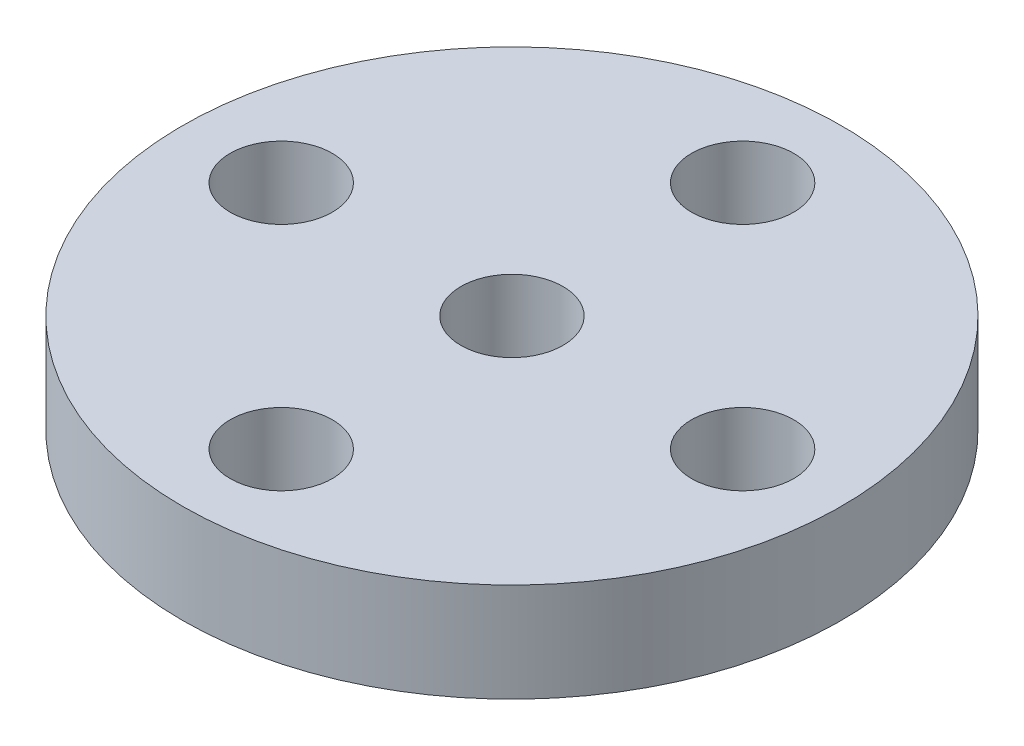
ISO-10303-21;
HEADER;
FILE_DESCRIPTION(('STEP AP214'),'2;1');
FILE_NAME('part.step','',(''),(''),'','','');
FILE_SCHEMA(('AUTOMOTIVE_DESIGN { 1 0 10303 214 1 1 1 1 }'));
ENDSEC;
DATA;
#1=APPLICATION_CONTEXT('core data for automotive mechanical design processes');
#2=APPLICATION_PROTOCOL_DEFINITION('international standard','automotive_design',2000,#1);
#3=PRODUCT_CONTEXT('',#1,'mechanical');
#4=PRODUCT('Part','Part','',(#3));
#5=PRODUCT_RELATED_PRODUCT_CATEGORY('part','',(#4));
#6=PRODUCT_DEFINITION_FORMATION('','',#4);
#7=PRODUCT_DEFINITION_CONTEXT('part definition',#1,'design');
#8=PRODUCT_DEFINITION('design','',#6,#7);
#9=PRODUCT_DEFINITION_SHAPE('','',#8);
#10=(LENGTH_UNIT() NAMED_UNIT(*) SI_UNIT(.MILLI.,.METRE.));
#11=(NAMED_UNIT(*) PLANE_ANGLE_UNIT() SI_UNIT($,.RADIAN.));
#12=(NAMED_UNIT(*) SI_UNIT($,.STERADIAN.) SOLID_ANGLE_UNIT());
#13=UNCERTAINTY_MEASURE_WITH_UNIT(LENGTH_MEASURE(1.E-05),#10,'distance_accuracy_value','');
#14=(GEOMETRIC_REPRESENTATION_CONTEXT(3) GLOBAL_UNCERTAINTY_ASSIGNED_CONTEXT((#13)) GLOBAL_UNIT_ASSIGNED_CONTEXT((#10,
#11,#12)) REPRESENTATION_CONTEXT('',''));
#15=CARTESIAN_POINT('',(0.,0.,0.));
#16=DIRECTION('',(0.,0.,1.));
#17=DIRECTION('',(1.,0.,0.));
#18=AXIS2_PLACEMENT_3D('',#15,#16,#17);
#19=CARTESIAN_POINT('',(0.,0.,0.));
#20=DIRECTION('',(0.,1.,0.));
#21=DIRECTION('',(0.,0.,1.));
#22=AXIS2_PLACEMENT_3D('',#19,#20,#21);
#23=PLANE('',#22);
#24=CARTESIAN_POINT('',(0.,0.,0.));
#25=DIRECTION('',(0.,1.,0.));
#26=DIRECTION('',(0.,0.,1.));
#27=AXIS2_PLACEMENT_3D('',#24,#25,#26);
#28=CIRCLE('',#27,4.);
#29=CARTESIAN_POINT('',(0.,0.,4.));
#30=VERTEX_POINT('',#29);
#31=EDGE_CURVE('E36',#30,#30,#28,.T.);
#32=ORIENTED_EDGE('',*,*,#31,.F.);
#33=EDGE_LOOP('',(#32));
#34=FACE_BOUND('',#33,.T.);
#35=CARTESIAN_POINT('',(0.,0.,0.));
#36=DIRECTION('',(0.,1.,0.));
#37=DIRECTION('',(0.,0.,1.));
#38=AXIS2_PLACEMENT_3D('',#35,#36,#37);
#39=CIRCLE('',#38,1.55);
#40=CARTESIAN_POINT('',(0.,0.,1.55));
#41=VERTEX_POINT('',#40);
#42=EDGE_CURVE('E43',#41,#41,#39,.T.);
#43=ORIENTED_EDGE('',*,*,#42,.T.);
#44=EDGE_LOOP('',(#43));
#45=FACE_BOUND('',#44,.T.);
#46=ADVANCED_FACE('F32',(#34,#45),#23,.F.);
#47=CARTESIAN_POINT('',(0.,4.,0.));
#48=DIRECTION('',(0.,-1.,0.));
#49=DIRECTION('',(0.,0.,-1.));
#50=AXIS2_PLACEMENT_3D('',#47,#48,#49);
#51=CYLINDRICAL_SURFACE('',#50,4.);
#52=CARTESIAN_POINT('',(0.,4.,0.));
#53=DIRECTION('',(0.,1.,0.));
#54=DIRECTION('',(0.,0.,1.));
#55=AXIS2_PLACEMENT_3D('',#52,#53,#54);
#56=CIRCLE('',#55,4.);
#57=CARTESIAN_POINT('',(0.,4.,4.));
#58=VERTEX_POINT('',#57);
#59=EDGE_CURVE('E10',#58,#58,#56,.T.);
#60=ORIENTED_EDGE('',*,*,#59,.F.);
#61=EDGE_LOOP('',(#60));
#62=FACE_BOUND('',#61,.T.);
#63=ORIENTED_EDGE('',*,*,#31,.T.);
#64=EDGE_LOOP('',(#63));
#65=FACE_BOUND('',#64,.T.);
#66=ADVANCED_FACE('F34',(#62,#65),#51,.T.);
#67=CARTESIAN_POINT('',(0.,4.,0.));
#68=DIRECTION('',(0.,-1.,0.));
#69=DIRECTION('',(0.,0.,-1.));
#70=AXIS2_PLACEMENT_3D('',#67,#68,#69);
#71=CYLINDRICAL_SURFACE('',#70,1.55);
#72=ORIENTED_EDGE('',*,*,#42,.F.);
#73=EDGE_LOOP('',(#72));
#74=FACE_BOUND('',#73,.T.);
#75=CARTESIAN_POINT('',(0.,7.,0.));
#76=DIRECTION('',(0.,1.,0.));
#77=DIRECTION('',(0.,0.,1.));
#78=AXIS2_PLACEMENT_3D('',#75,#76,#77);
#79=CIRCLE('',#78,1.55);
#80=CARTESIAN_POINT('',(0.,7.,1.55));
#81=VERTEX_POINT('',#80);
#82=EDGE_CURVE('E51',#81,#81,#79,.T.);
#83=ORIENTED_EDGE('',*,*,#82,.T.);
#84=EDGE_LOOP('',(#83));
#85=FACE_BOUND('',#84,.T.);
#86=ADVANCED_FACE('F87',(#74,#85),#71,.F.);
#87=CARTESIAN_POINT('',(0.,7.,0.));
#88=DIRECTION('',(0.,1.,0.));
#89=DIRECTION('',(0.,0.,1.));
#90=AXIS2_PLACEMENT_3D('',#87,#88,#89);
#91=PLANE('',#90);
#92=CARTESIAN_POINT('',(3.95332173747447E-13,7.,7.));
#93=DIRECTION('',(0.,1.,0.));
#94=DIRECTION('',(0.,0.,1.));
#95=AXIS2_PLACEMENT_3D('',#92,#93,#94);
#96=CIRCLE('',#95,1.55000000000042);
#97=CARTESIAN_POINT('',(3.95332173747447E-13,7.,8.55000000000043));
#98=VERTEX_POINT('',#97);
#99=EDGE_CURVE('E66',#98,#98,#96,.T.);
#100=ORIENTED_EDGE('',*,*,#99,.F.);
#101=EDGE_LOOP('',(#100));
#102=FACE_BOUND('',#101,.T.);
#103=CARTESIAN_POINT('',(0.,7.,-7.));
#104=DIRECTION('',(0.,1.,0.));
#105=DIRECTION('',(0.,0.,1.));
#106=AXIS2_PLACEMENT_3D('',#103,#104,#105);
#107=CIRCLE('',#106,1.55);
#108=CARTESIAN_POINT('',(0.,7.,-5.45));
#109=VERTEX_POINT('',#108);
#110=EDGE_CURVE('E56',#109,#109,#107,.T.);
#111=ORIENTED_EDGE('',*,*,#110,.F.);
#112=EDGE_LOOP('',(#111));
#113=FACE_BOUND('',#112,.T.);
#114=CARTESIAN_POINT('',(0.,7.,0.));
#115=DIRECTION('',(0.,1.,0.));
#116=DIRECTION('',(0.,0.,1.));
#117=AXIS2_PLACEMENT_3D('',#114,#115,#116);
#118=CIRCLE('',#117,10.);
#119=CARTESIAN_POINT('',(0.,7.,10.));
#120=VERTEX_POINT('',#119);
#121=EDGE_CURVE('E47',#120,#120,#118,.T.);
#122=ORIENTED_EDGE('',*,*,#121,.T.);
#123=EDGE_LOOP('',(#122));
#124=FACE_BOUND('',#123,.T.);
#125=ORIENTED_EDGE('',*,*,#82,.F.);
#126=EDGE_LOOP('',(#125));
#127=FACE_BOUND('',#126,.T.);
#128=CARTESIAN_POINT('',(7.0000000000002,7.,-1.97666086873723E-13));
#129=DIRECTION('',(0.,1.,0.));
#130=DIRECTION('',(0.,0.,1.));
#131=AXIS2_PLACEMENT_3D('',#128,#129,#130);
#132=CIRCLE('',#131,1.55000000000015);
#133=CARTESIAN_POINT('',(7.0000000000002,7.,1.54999999999996));
#134=VERTEX_POINT('',#133);
#135=EDGE_CURVE('E60',#134,#134,#132,.T.);
#136=ORIENTED_EDGE('',*,*,#135,.F.);
#137=EDGE_LOOP('',(#136));
#138=FACE_BOUND('',#137,.T.);
#139=CARTESIAN_POINT('',(-6.9999999999998,7.,1.98523339633126E-13));
#140=DIRECTION('',(0.,1.,0.));
#141=DIRECTION('',(0.,0.,1.));
#142=AXIS2_PLACEMENT_3D('',#139,#140,#141);
#143=CIRCLE('',#142,1.55000000000032);
#144=CARTESIAN_POINT('',(-6.9999999999998,7.,1.55000000000052));
#145=VERTEX_POINT('',#144);
#146=EDGE_CURVE('E72',#145,#145,#143,.T.);
#147=ORIENTED_EDGE('',*,*,#146,.F.);
#148=EDGE_LOOP('',(#147));
#149=FACE_BOUND('',#148,.T.);
#150=ADVANCED_FACE('F84',(#102,#113,#124,#127,#138,#149),#91,.T.);
#151=CARTESIAN_POINT('',(0.,4.,0.));
#152=DIRECTION('',(0.,1.,0.));
#153=DIRECTION('',(0.,0.,1.));
#154=AXIS2_PLACEMENT_3D('',#151,#152,#153);
#155=PLANE('',#154);
#156=ORIENTED_EDGE('',*,*,#59,.T.);
#157=EDGE_LOOP('',(#156));
#158=FACE_BOUND('',#157,.T.);
#159=CARTESIAN_POINT('',(0.,4.,0.));
#160=DIRECTION('',(0.,1.,0.));
#161=DIRECTION('',(0.,0.,1.));
#162=AXIS2_PLACEMENT_3D('',#159,#160,#161);
#163=CIRCLE('',#162,10.);
#164=CARTESIAN_POINT('',(0.,4.,10.));
#165=VERTEX_POINT('',#164);
#166=EDGE_CURVE('E48',#165,#165,#163,.T.);
#167=ORIENTED_EDGE('',*,*,#166,.F.);
#168=EDGE_LOOP('',(#167));
#169=FACE_BOUND('',#168,.T.);
#170=CARTESIAN_POINT('',(0.,4.,-7.));
#171=DIRECTION('',(0.,1.,0.));
#172=DIRECTION('',(0.,0.,1.));
#173=AXIS2_PLACEMENT_3D('',#170,#171,#172);
#174=CIRCLE('',#173,1.55);
#175=CARTESIAN_POINT('',(0.,4.,-5.45));
#176=VERTEX_POINT('',#175);
#177=EDGE_CURVE('E57',#176,#176,#174,.T.);
#178=ORIENTED_EDGE('',*,*,#177,.T.);
#179=EDGE_LOOP('',(#178));
#180=FACE_BOUND('',#179,.T.);
#181=CARTESIAN_POINT('',(7.0000000000002,4.,-1.97666086873723E-13));
#182=DIRECTION('',(0.,1.,0.));
#183=DIRECTION('',(0.,0.,1.));
#184=AXIS2_PLACEMENT_3D('',#181,#182,#183);
#185=CIRCLE('',#184,1.55000000000015);
#186=CARTESIAN_POINT('',(7.0000000000002,4.,1.54999999999996));
#187=VERTEX_POINT('',#186);
#188=EDGE_CURVE('E63',#187,#187,#185,.T.);
#189=ORIENTED_EDGE('',*,*,#188,.T.);
#190=EDGE_LOOP('',(#189));
#191=FACE_BOUND('',#190,.T.);
#192=CARTESIAN_POINT('',(3.95332173747447E-13,4.,7.));
#193=DIRECTION('',(0.,1.,0.));
#194=DIRECTION('',(0.,0.,1.));
#195=AXIS2_PLACEMENT_3D('',#192,#193,#194);
#196=CIRCLE('',#195,1.55000000000042);
#197=CARTESIAN_POINT('',(3.95332173747447E-13,4.,8.55000000000043));
#198=VERTEX_POINT('',#197);
#199=EDGE_CURVE('E69',#198,#198,#196,.T.);
#200=ORIENTED_EDGE('',*,*,#199,.T.);
#201=EDGE_LOOP('',(#200));
#202=FACE_BOUND('',#201,.T.);
#203=CARTESIAN_POINT('',(-6.9999999999998,4.,1.98523339633126E-13));
#204=DIRECTION('',(0.,1.,0.));
#205=DIRECTION('',(0.,0.,1.));
#206=AXIS2_PLACEMENT_3D('',#203,#204,#205);
#207=CIRCLE('',#206,1.55000000000032);
#208=CARTESIAN_POINT('',(-6.9999999999998,4.,1.55000000000052));
#209=VERTEX_POINT('',#208);
#210=EDGE_CURVE('E75',#209,#209,#207,.T.);
#211=ORIENTED_EDGE('',*,*,#210,.T.);
#212=EDGE_LOOP('',(#211));
#213=FACE_BOUND('',#212,.T.);
#214=ADVANCED_FACE('F86',(#158,#169,#180,#191,#202,#213),#155,.F.);
#215=CARTESIAN_POINT('',(0.,7.,0.));
#216=DIRECTION('',(0.,-1.,0.));
#217=DIRECTION('',(0.,0.,-1.));
#218=AXIS2_PLACEMENT_3D('',#215,#216,#217);
#219=CYLINDRICAL_SURFACE('',#218,10.);
#220=ORIENTED_EDGE('',*,*,#121,.F.);
#221=EDGE_LOOP('',(#220));
#222=FACE_BOUND('',#221,.T.);
#223=ORIENTED_EDGE('',*,*,#166,.T.);
#224=EDGE_LOOP('',(#223));
#225=FACE_BOUND('',#224,.T.);
#226=ADVANCED_FACE('F94',(#222,#225),#219,.T.);
#227=CARTESIAN_POINT('',(0.,7.,-7.));
#228=DIRECTION('',(0.,-1.,0.));
#229=DIRECTION('',(0.,0.,-1.));
#230=AXIS2_PLACEMENT_3D('',#227,#228,#229);
#231=CYLINDRICAL_SURFACE('',#230,1.55);
#232=ORIENTED_EDGE('',*,*,#110,.T.);
#233=EDGE_LOOP('',(#232));
#234=FACE_BOUND('',#233,.T.);
#235=ORIENTED_EDGE('',*,*,#177,.F.);
#236=EDGE_LOOP('',(#235));
#237=FACE_BOUND('',#236,.T.);
#238=ADVANCED_FACE('F111',(#234,#237),#231,.F.);
#239=CARTESIAN_POINT('',(7.0000000000002,7.,-1.97666086873723E-13));
#240=DIRECTION('',(0.,-1.,0.));
#241=DIRECTION('',(0.,0.,-1.));
#242=AXIS2_PLACEMENT_3D('',#239,#240,#241);
#243=CYLINDRICAL_SURFACE('',#242,1.55000000000015);
#244=ORIENTED_EDGE('',*,*,#135,.T.);
#245=EDGE_LOOP('',(#244));
#246=FACE_BOUND('',#245,.T.);
#247=ORIENTED_EDGE('',*,*,#188,.F.);
#248=EDGE_LOOP('',(#247));
#249=FACE_BOUND('',#248,.T.);
#250=ADVANCED_FACE('F116',(#246,#249),#243,.F.);
#251=CARTESIAN_POINT('',(3.95332173747447E-13,7.,7.));
#252=DIRECTION('',(0.,-1.,0.));
#253=DIRECTION('',(0.,0.,-1.));
#254=AXIS2_PLACEMENT_3D('',#251,#252,#253);
#255=CYLINDRICAL_SURFACE('',#254,1.55000000000042);
#256=ORIENTED_EDGE('',*,*,#99,.T.);
#257=EDGE_LOOP('',(#256));
#258=FACE_BOUND('',#257,.T.);
#259=ORIENTED_EDGE('',*,*,#199,.F.);
#260=EDGE_LOOP('',(#259));
#261=FACE_BOUND('',#260,.T.);
#262=ADVANCED_FACE('F131',(#258,#261),#255,.F.);
#263=CARTESIAN_POINT('',(-6.9999999999998,7.,1.98523339633126E-13));
#264=DIRECTION('',(0.,-1.,0.));
#265=DIRECTION('',(0.,0.,-1.));
#266=AXIS2_PLACEMENT_3D('',#263,#264,#265);
#267=CYLINDRICAL_SURFACE('',#266,1.55000000000032);
#268=ORIENTED_EDGE('',*,*,#146,.T.);
#269=EDGE_LOOP('',(#268));
#270=FACE_BOUND('',#269,.T.);
#271=ORIENTED_EDGE('',*,*,#210,.F.);
#272=EDGE_LOOP('',(#271));
#273=FACE_BOUND('',#272,.T.);
#274=ADVANCED_FACE('F81',(#270,#273),#267,.F.);
#275=CLOSED_SHELL('',(#46,#66,#86,#150,#214,#226,#238,#250,#262,#274));
#276=MANIFOLD_SOLID_BREP('B2',#275);
#277=ADVANCED_BREP_SHAPE_REPRESENTATION('',(#18,#276),#14);
#278=SHAPE_DEFINITION_REPRESENTATION(#9,#277);
ENDSEC;
END-ISO-10303-21;
